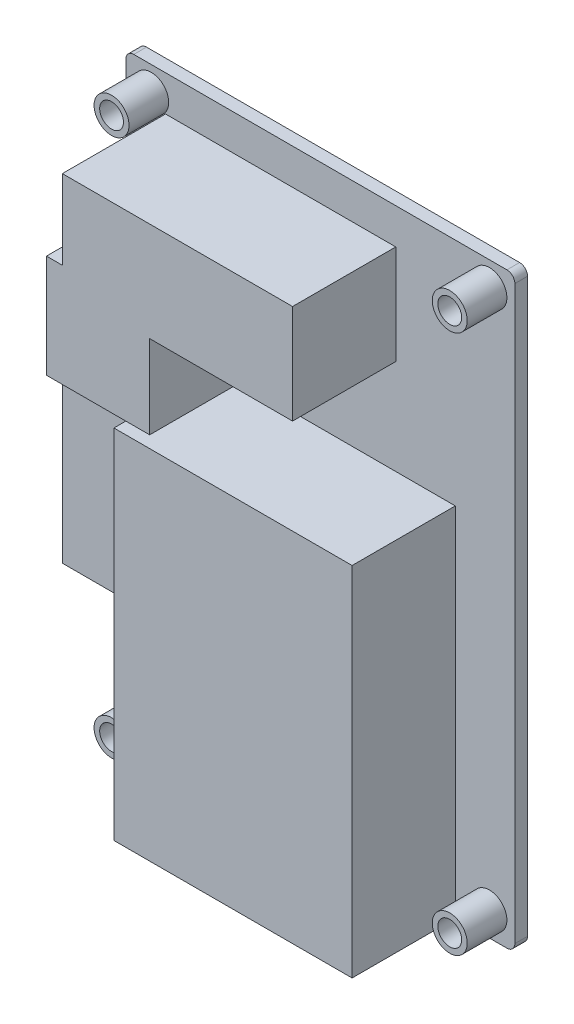
ISO-10303-21;
HEADER;
FILE_DESCRIPTION(('STEP AP214'),'2;1');
FILE_NAME('part.step','',(''),(''),'','','');
FILE_SCHEMA(('AUTOMOTIVE_DESIGN { 1 0 10303 214 1 1 1 1 }'));
ENDSEC;
DATA;
#1=APPLICATION_CONTEXT('core data for automotive mechanical design processes');
#2=APPLICATION_PROTOCOL_DEFINITION('international standard','automotive_design',2000,#1);
#3=PRODUCT_CONTEXT('',#1,'mechanical');
#4=PRODUCT('Part','Part','',(#3));
#5=PRODUCT_RELATED_PRODUCT_CATEGORY('part','',(#4));
#6=PRODUCT_DEFINITION_FORMATION('','',#4);
#7=PRODUCT_DEFINITION_CONTEXT('part definition',#1,'design');
#8=PRODUCT_DEFINITION('design','',#6,#7);
#9=PRODUCT_DEFINITION_SHAPE('','',#8);
#10=(LENGTH_UNIT() NAMED_UNIT(*) SI_UNIT(.MILLI.,.METRE.));
#11=(NAMED_UNIT(*) PLANE_ANGLE_UNIT() SI_UNIT($,.RADIAN.));
#12=(NAMED_UNIT(*) SI_UNIT($,.STERADIAN.) SOLID_ANGLE_UNIT());
#13=UNCERTAINTY_MEASURE_WITH_UNIT(LENGTH_MEASURE(1.E-05),#10,'distance_accuracy_value','');
#14=(GEOMETRIC_REPRESENTATION_CONTEXT(3) GLOBAL_UNCERTAINTY_ASSIGNED_CONTEXT((#13)) GLOBAL_UNIT_ASSIGNED_CONTEXT((#10,
#11,#12)) REPRESENTATION_CONTEXT('',''));
#15=CARTESIAN_POINT('',(0.,0.,0.));
#16=DIRECTION('',(0.,0.,1.));
#17=DIRECTION('',(1.,0.,0.));
#18=AXIS2_PLACEMENT_3D('',#15,#16,#17);
#19=CARTESIAN_POINT('',(-21.5,9.49999999999999,14.6));
#20=DIRECTION('',(1.,0.,0.));
#21=DIRECTION('',(0.,0.,-1.));
#22=AXIS2_PLACEMENT_3D('',#19,#20,#21);
#23=PLANE('',#22);
#24=DIRECTION('',(0.,0.,-1.));
#25=VECTOR('',#24,1.);
#26=CARTESIAN_POINT('',(-21.5,9.99999999999999,4.6));
#27=LINE('',#26,#25);
#28=CARTESIAN_POINT('',(-21.5,9.99999999999999,4.6));
#29=VERTEX_POINT('',#28);
#30=CARTESIAN_POINT('',(-21.5,9.99999999999999,1.6));
#31=VERTEX_POINT('',#30);
#32=EDGE_CURVE('E262',#29,#31,#27,.T.);
#33=ORIENTED_EDGE('',*,*,#32,.F.);
#34=DIRECTION('',(0.,1.,0.));
#35=VECTOR('',#34,1.);
#36=CARTESIAN_POINT('',(-21.5,0.,4.6));
#37=LINE('',#36,#35);
#38=CARTESIAN_POINT('',(-21.5,9.49999999999999,4.6));
#39=VERTEX_POINT('',#38);
#40=EDGE_CURVE('E247',#39,#29,#37,.T.);
#41=ORIENTED_EDGE('',*,*,#40,.F.);
#42=DIRECTION('',(0.,0.,-1.));
#43=VECTOR('',#42,1.);
#44=CARTESIAN_POINT('',(-21.5,9.49999999999999,14.6));
#45=LINE('',#44,#43);
#46=CARTESIAN_POINT('',(-21.5,9.49999999999999,14.6));
#47=VERTEX_POINT('',#46);
#48=EDGE_CURVE('E337',#47,#39,#45,.T.);
#49=ORIENTED_EDGE('',*,*,#48,.F.);
#50=DIRECTION('',(0.,-1.,0.));
#51=VECTOR('',#50,1.);
#52=CARTESIAN_POINT('',(-21.5,9.49999999999999,14.6));
#53=LINE('',#52,#51);
#54=CARTESIAN_POINT('',(-21.5,22.5,14.6));
#55=VERTEX_POINT('',#54);
#56=EDGE_CURVE('E309',#55,#47,#53,.T.);
#57=ORIENTED_EDGE('',*,*,#56,.F.);
#58=DIRECTION('',(0.,0.,-1.));
#59=VECTOR('',#58,1.);
#60=CARTESIAN_POINT('',(-21.5,22.5,14.6));
#61=LINE('',#60,#59);
#62=CARTESIAN_POINT('',(-21.5,22.5,1.6));
#63=VERTEX_POINT('',#62);
#64=EDGE_CURVE('E340',#55,#63,#61,.T.);
#65=ORIENTED_EDGE('',*,*,#64,.T.);
#66=DIRECTION('',(0.,-1.,0.));
#67=VECTOR('',#66,1.);
#68=CARTESIAN_POINT('',(-21.5,9.49999999999999,1.6));
#69=LINE('',#68,#67);
#70=EDGE_CURVE('E331',#63,#31,#69,.T.);
#71=ORIENTED_EDGE('',*,*,#70,.T.);
#72=EDGE_LOOP('',(#33,#41,#49,#57,#65,#71));
#73=FACE_BOUND('',#72,.T.);
#74=ADVANCED_FACE('F42',(#73),#23,.F.);
#75=CARTESIAN_POINT('',(-8.50000000000001,9.49999999999999,14.6));
#76=DIRECTION('',(0.,1.,0.));
#77=DIRECTION('',(-1.,0.,0.));
#78=AXIS2_PLACEMENT_3D('',#75,#76,#77);
#79=PLANE('',#78);
#80=DIRECTION('',(0.,0.,-1.));
#81=VECTOR('',#80,1.);
#82=CARTESIAN_POINT('',(-18.5,9.49999999999999,4.6));
#83=LINE('',#82,#81);
#84=CARTESIAN_POINT('',(-18.5,9.49999999999999,4.6));
#85=VERTEX_POINT('',#84);
#86=CARTESIAN_POINT('',(-18.5,9.49999999999999,1.6));
#87=VERTEX_POINT('',#86);
#88=EDGE_CURVE('E57',#85,#87,#83,.T.);
#89=ORIENTED_EDGE('',*,*,#88,.T.);
#90=DIRECTION('',(1.,0.,0.));
#91=VECTOR('',#90,1.);
#92=CARTESIAN_POINT('',(-8.50000000000001,9.49999999999999,1.6));
#93=LINE('',#92,#91);
#94=CARTESIAN_POINT('',(-8.50000000000001,9.49999999999999,1.6));
#95=VERTEX_POINT('',#94);
#96=EDGE_CURVE('E299',#87,#95,#93,.T.);
#97=ORIENTED_EDGE('',*,*,#96,.T.);
#98=DIRECTION('',(0.,0.,-1.));
#99=VECTOR('',#98,1.);
#100=CARTESIAN_POINT('',(-8.50000000000001,9.49999999999999,14.6));
#101=LINE('',#100,#99);
#102=CARTESIAN_POINT('',(-8.50000000000001,9.49999999999999,14.6));
#103=VERTEX_POINT('',#102);
#104=EDGE_CURVE('E313',#103,#95,#101,.T.);
#105=ORIENTED_EDGE('',*,*,#104,.F.);
#106=DIRECTION('',(1.,0.,0.));
#107=VECTOR('',#106,1.);
#108=CARTESIAN_POINT('',(-8.50000000000001,9.49999999999999,14.6));
#109=LINE('',#108,#107);
#110=EDGE_CURVE('E311',#47,#103,#109,.T.);
#111=ORIENTED_EDGE('',*,*,#110,.F.);
#112=ORIENTED_EDGE('',*,*,#48,.T.);
#113=DIRECTION('',(-1.,0.,0.));
#114=VECTOR('',#113,1.);
#115=CARTESIAN_POINT('',(0.,9.5,4.6));
#116=LINE('',#115,#114);
#117=EDGE_CURVE('E243',#85,#39,#116,.T.);
#118=ORIENTED_EDGE('',*,*,#117,.F.);
#119=EDGE_LOOP('',(#89,#97,#105,#111,#112,#118));
#120=FACE_BOUND('',#119,.T.);
#121=ADVANCED_FACE('F468',(#120),#79,.F.);
#122=CARTESIAN_POINT('',(-23.5,-36.,1.6));
#123=DIRECTION('',(0.,0.,-1.));
#124=DIRECTION('',(-1.,0.,0.));
#125=AXIS2_PLACEMENT_3D('',#122,#123,#124);
#126=PLANE('',#125);
#127=DIRECTION('',(0.,1.,0.));
#128=VECTOR('',#127,1.);
#129=CARTESIAN_POINT('',(-18.5,0.,1.6));
#130=LINE('',#129,#128);
#131=CARTESIAN_POINT('',(-18.5,-20.,1.6));
#132=VERTEX_POINT('',#131);
#133=EDGE_CURVE('E256',#132,#87,#130,.T.);
#134=ORIENTED_EDGE('',*,*,#133,.F.);
#135=DIRECTION('',(-1.,0.,0.));
#136=VECTOR('',#135,1.);
#137=CARTESIAN_POINT('',(0.,-20.,1.6));
#138=LINE('',#137,#136);
#139=CARTESIAN_POINT('',(-24.5,-20.,1.6));
#140=VERTEX_POINT('',#139);
#141=EDGE_CURVE('E253',#132,#140,#138,.T.);
#142=ORIENTED_EDGE('',*,*,#141,.T.);
#143=DIRECTION('',(0.,-1.,0.));
#144=VECTOR('',#143,1.);
#145=CARTESIAN_POINT('',(-24.5,-36.,1.6));
#146=LINE('',#145,#144);
#147=CARTESIAN_POINT('',(-24.5,-36.,1.6));
#148=VERTEX_POINT('',#147);
#149=EDGE_CURVE('E412',#140,#148,#146,.T.);
#150=ORIENTED_EDGE('',*,*,#149,.T.);
#151=CARTESIAN_POINT('',(-23.5,-36.,1.6));
#152=DIRECTION('',(0.,0.,1.));
#153=DIRECTION('',(-1.,0.,0.));
#154=AXIS2_PLACEMENT_3D('',#151,#152,#153);
#155=CIRCLE('',#154,1.);
#156=CARTESIAN_POINT('',(-23.5,-37.,1.6));
#157=VERTEX_POINT('',#156);
#158=EDGE_CURVE('E395',#148,#157,#155,.T.);
#159=ORIENTED_EDGE('',*,*,#158,.T.);
#160=DIRECTION('',(1.,0.,0.));
#161=VECTOR('',#160,1.);
#162=CARTESIAN_POINT('',(-23.5,-37.,1.6));
#163=LINE('',#162,#161);
#164=CARTESIAN_POINT('',(-13.,-37.,1.6));
#165=VERTEX_POINT('',#164);
#166=EDGE_CURVE('E400',#157,#165,#163,.T.);
#167=ORIENTED_EDGE('',*,*,#166,.T.);
#168=DIRECTION('',(0.,-1.,0.));
#169=VECTOR('',#168,1.);
#170=CARTESIAN_POINT('',(-13.,7.99999999999999,1.6));
#171=LINE('',#170,#169);
#172=CARTESIAN_POINT('',(-13.,7.99999999999999,1.6));
#173=VERTEX_POINT('',#172);
#174=EDGE_CURVE('E65',#173,#165,#171,.T.);
#175=ORIENTED_EDGE('',*,*,#174,.F.);
#176=DIRECTION('',(-1.,0.,0.));
#177=VECTOR('',#176,1.);
#178=CARTESIAN_POINT('',(-13.,7.99999999999999,1.6));
#179=LINE('',#178,#177);
#180=CARTESIAN_POINT('',(17.,7.99999999999999,1.6));
#181=VERTEX_POINT('',#180);
#182=EDGE_CURVE('E280',#181,#173,#179,.T.);
#183=ORIENTED_EDGE('',*,*,#182,.F.);
#184=DIRECTION('',(0.,1.,0.));
#185=VECTOR('',#184,1.);
#186=CARTESIAN_POINT('',(17.,7.99999999999999,1.6));
#187=LINE('',#186,#185);
#188=CARTESIAN_POINT('',(17.,-37.,1.6));
#189=VERTEX_POINT('',#188);
#190=EDGE_CURVE('E282',#189,#181,#187,.T.);
#191=ORIENTED_EDGE('',*,*,#190,.F.);
#192=CARTESIAN_POINT('',(23.5,-37.,1.6));
#193=VERTEX_POINT('',#192);
#194=EDGE_CURVE('E398',#189,#193,#163,.T.);
#195=ORIENTED_EDGE('',*,*,#194,.T.);
#196=CARTESIAN_POINT('',(23.5,-36.,1.6));
#197=DIRECTION('',(0.,0.,1.));
#198=DIRECTION('',(1.,0.,0.));
#199=AXIS2_PLACEMENT_3D('',#196,#197,#198);
#200=CIRCLE('',#199,1.);
#201=CARTESIAN_POINT('',(24.5,-36.,1.6));
#202=VERTEX_POINT('',#201);
#203=EDGE_CURVE('E402',#193,#202,#200,.T.);
#204=ORIENTED_EDGE('',*,*,#203,.T.);
#205=DIRECTION('',(0.,1.,0.));
#206=VECTOR('',#205,1.);
#207=CARTESIAN_POINT('',(24.5,-36.,1.6));
#208=LINE('',#207,#206);
#209=CARTESIAN_POINT('',(24.5,36.,1.6));
#210=VERTEX_POINT('',#209);
#211=EDGE_CURVE('E404',#202,#210,#208,.T.);
#212=ORIENTED_EDGE('',*,*,#211,.T.);
#213=CARTESIAN_POINT('',(23.5,36.,1.6));
#214=DIRECTION('',(0.,0.,1.));
#215=DIRECTION('',(-1.,0.,0.));
#216=AXIS2_PLACEMENT_3D('',#213,#214,#215);
#217=CIRCLE('',#216,1.);
#218=CARTESIAN_POINT('',(23.5,37.,1.6));
#219=VERTEX_POINT('',#218);
#220=EDGE_CURVE('E406',#210,#219,#217,.T.);
#221=ORIENTED_EDGE('',*,*,#220,.T.);
#222=DIRECTION('',(-1.,0.,0.));
#223=VECTOR('',#222,1.);
#224=CARTESIAN_POINT('',(-23.5,37.,1.6));
#225=LINE('',#224,#223);
#226=CARTESIAN_POINT('',(-23.5,37.,1.6));
#227=VERTEX_POINT('',#226);
#228=EDGE_CURVE('E408',#219,#227,#225,.T.);
#229=ORIENTED_EDGE('',*,*,#228,.T.);
#230=CARTESIAN_POINT('',(-23.5,36.,1.6));
#231=DIRECTION('',(0.,0.,1.));
#232=DIRECTION('',(-1.,0.,0.));
#233=AXIS2_PLACEMENT_3D('',#230,#231,#232);
#234=CIRCLE('',#233,1.);
#235=CARTESIAN_POINT('',(-24.5,36.,1.6));
#236=VERTEX_POINT('',#235);
#237=EDGE_CURVE('E410',#227,#236,#234,.T.);
#238=ORIENTED_EDGE('',*,*,#237,.T.);
#239=CARTESIAN_POINT('',(-24.5,9.99999999999999,1.6));
#240=VERTEX_POINT('',#239);
#241=EDGE_CURVE('E413',#236,#240,#146,.T.);
#242=ORIENTED_EDGE('',*,*,#241,.T.);
#243=DIRECTION('',(-1.,0.,0.));
#244=VECTOR('',#243,1.);
#245=CARTESIAN_POINT('',(0.,9.99999999999999,1.6));
#246=LINE('',#245,#244);
#247=EDGE_CURVE('E237',#31,#240,#246,.T.);
#248=ORIENTED_EDGE('',*,*,#247,.F.);
#249=ORIENTED_EDGE('',*,*,#70,.F.);
#250=DIRECTION('',(-1.,0.,0.));
#251=VECTOR('',#250,1.);
#252=CARTESIAN_POINT('',(-21.5,22.5,1.6));
#253=LINE('',#252,#251);
#254=CARTESIAN_POINT('',(-19.5,22.5,1.6));
#255=VERTEX_POINT('',#254);
#256=EDGE_CURVE('E328',#255,#63,#253,.T.);
#257=ORIENTED_EDGE('',*,*,#256,.F.);
#258=DIRECTION('',(0.,-1.,0.));
#259=VECTOR('',#258,1.);
#260=CARTESIAN_POINT('',(-19.5,22.5,1.6));
#261=LINE('',#260,#259);
#262=CARTESIAN_POINT('',(-19.5,32.5,1.6));
#263=VERTEX_POINT('',#262);
#264=EDGE_CURVE('E325',#263,#255,#261,.T.);
#265=ORIENTED_EDGE('',*,*,#264,.F.);
#266=DIRECTION('',(-1.,0.,0.));
#267=VECTOR('',#266,1.);
#268=CARTESIAN_POINT('',(-19.5,32.5,1.6));
#269=LINE('',#268,#267);
#270=CARTESIAN_POINT('',(9.49999999999999,32.5,1.6));
#271=VERTEX_POINT('',#270);
#272=EDGE_CURVE('E322',#271,#263,#269,.T.);
#273=ORIENTED_EDGE('',*,*,#272,.F.);
#274=DIRECTION('',(0.,1.,0.));
#275=VECTOR('',#274,1.);
#276=CARTESIAN_POINT('',(9.49999999999999,32.5,1.6));
#277=LINE('',#276,#275);
#278=CARTESIAN_POINT('',(9.49999999999999,20.,1.6));
#279=VERTEX_POINT('',#278);
#280=EDGE_CURVE('E319',#279,#271,#277,.T.);
#281=ORIENTED_EDGE('',*,*,#280,.F.);
#282=DIRECTION('',(1.,0.,0.));
#283=VECTOR('',#282,1.);
#284=CARTESIAN_POINT('',(9.49999999999999,20.,1.6));
#285=LINE('',#284,#283);
#286=CARTESIAN_POINT('',(-8.50000000000001,20.,1.6));
#287=VERTEX_POINT('',#286);
#288=EDGE_CURVE('E316',#287,#279,#285,.T.);
#289=ORIENTED_EDGE('',*,*,#288,.F.);
#290=DIRECTION('',(0.,1.,0.));
#291=VECTOR('',#290,1.);
#292=CARTESIAN_POINT('',(-8.50000000000001,20.,1.6));
#293=LINE('',#292,#291);
#294=EDGE_CURVE('E287',#95,#287,#293,.T.);
#295=ORIENTED_EDGE('',*,*,#294,.F.);
#296=ORIENTED_EDGE('',*,*,#96,.F.);
#297=EDGE_LOOP('',(#134,#142,#150,#159,#167,#175,#183,#191,#195,#204,#212,#221,#229,#238,#242,
#248,#249,#257,#265,#273,#281,#289,#295,#296));
#298=FACE_BOUND('',#297,.T.);
#299=CARTESIAN_POINT('',(-21.3,-33.95,1.6));
#300=DIRECTION('',(0.,0.,-1.));
#301=DIRECTION('',(-1.,0.,0.));
#302=AXIS2_PLACEMENT_3D('',#299,#300,#301);
#303=CIRCLE('',#302,2.2);
#304=CARTESIAN_POINT('',(-23.5,-33.95,1.6));
#305=VERTEX_POINT('',#304);
#306=EDGE_CURVE('E50',#305,#305,#303,.F.);
#307=ORIENTED_EDGE('',*,*,#306,.F.);
#308=EDGE_LOOP('',(#307));
#309=FACE_BOUND('',#308,.T.);
#310=CARTESIAN_POINT('',(-21.3,33.95,1.6));
#311=DIRECTION('',(0.,0.,-1.));
#312=DIRECTION('',(-1.,0.,0.));
#313=AXIS2_PLACEMENT_3D('',#310,#311,#312);
#314=CIRCLE('',#313,2.2);
#315=CARTESIAN_POINT('',(-23.5,33.95,1.6));
#316=VERTEX_POINT('',#315);
#317=EDGE_CURVE('E455',#316,#316,#314,.F.);
#318=ORIENTED_EDGE('',*,*,#317,.F.);
#319=EDGE_LOOP('',(#318));
#320=FACE_BOUND('',#319,.T.);
#321=CARTESIAN_POINT('',(21.3,-33.95,1.6));
#322=DIRECTION('',(0.,0.,-1.));
#323=DIRECTION('',(-1.,0.,0.));
#324=AXIS2_PLACEMENT_3D('',#321,#322,#323);
#325=CIRCLE('',#324,2.2);
#326=CARTESIAN_POINT('',(19.1,-33.95,1.6));
#327=VERTEX_POINT('',#326);
#328=EDGE_CURVE('E458',#327,#327,#325,.F.);
#329=ORIENTED_EDGE('',*,*,#328,.F.);
#330=EDGE_LOOP('',(#329));
#331=FACE_BOUND('',#330,.T.);
#332=CARTESIAN_POINT('',(21.3,33.95,1.6));
#333=DIRECTION('',(0.,0.,-1.));
#334=DIRECTION('',(-1.,0.,0.));
#335=AXIS2_PLACEMENT_3D('',#332,#333,#334);
#336=CIRCLE('',#335,2.2);
#337=CARTESIAN_POINT('',(19.1,33.95,1.6));
#338=VERTEX_POINT('',#337);
#339=EDGE_CURVE('E11',#338,#338,#336,.F.);
#340=ORIENTED_EDGE('',*,*,#339,.F.);
#341=EDGE_LOOP('',(#340));
#342=FACE_BOUND('',#341,.T.);
#343=ADVANCED_FACE('F465',(#298,#309,#320,#331,#342),#126,.F.);
#344=CARTESIAN_POINT('',(-23.5,-36.,1.6));
#345=DIRECTION('',(0.,0.,-1.));
#346=DIRECTION('',(-1.,0.,0.));
#347=AXIS2_PLACEMENT_3D('',#344,#345,#346);
#348=CYLINDRICAL_SURFACE('',#347,1.);
#349=CARTESIAN_POINT('',(-23.5,-36.,0.));
#350=DIRECTION('',(0.,0.,1.));
#351=DIRECTION('',(-1.,0.,0.));
#352=AXIS2_PLACEMENT_3D('',#349,#350,#351);
#353=CIRCLE('',#352,1.);
#354=CARTESIAN_POINT('',(-24.5,-36.,0.));
#355=VERTEX_POINT('',#354);
#356=CARTESIAN_POINT('',(-23.5,-37.,0.));
#357=VERTEX_POINT('',#356);
#358=EDGE_CURVE('E394',#355,#357,#353,.T.);
#359=ORIENTED_EDGE('',*,*,#358,.T.);
#360=DIRECTION('',(0.,0.,-1.));
#361=VECTOR('',#360,1.);
#362=CARTESIAN_POINT('',(-23.5,-37.,1.6));
#363=LINE('',#362,#361);
#364=EDGE_CURVE('E452',#157,#357,#363,.T.);
#365=ORIENTED_EDGE('',*,*,#364,.F.);
#366=ORIENTED_EDGE('',*,*,#158,.F.);
#367=DIRECTION('',(0.,0.,-1.));
#368=VECTOR('',#367,1.);
#369=CARTESIAN_POINT('',(-24.5,-36.,1.6));
#370=LINE('',#369,#368);
#371=EDGE_CURVE('E416',#148,#355,#370,.T.);
#372=ORIENTED_EDGE('',*,*,#371,.T.);
#373=EDGE_LOOP('',(#359,#365,#366,#372));
#374=FACE_BOUND('',#373,.T.);
#375=ADVANCED_FACE('F44',(#374),#348,.T.);
#376=CARTESIAN_POINT('',(-23.5,-37.,1.6));
#377=DIRECTION('',(0.,1.,0.));
#378=DIRECTION('',(0.,0.,1.));
#379=AXIS2_PLACEMENT_3D('',#376,#377,#378);
#380=PLANE('',#379);
#381=DIRECTION('',(1.,0.,0.));
#382=VECTOR('',#381,1.);
#383=CARTESIAN_POINT('',(-23.5,-37.,0.));
#384=LINE('',#383,#382);
#385=CARTESIAN_POINT('',(23.5,-37.,0.));
#386=VERTEX_POINT('',#385);
#387=EDGE_CURVE('E419',#357,#386,#384,.T.);
#388=ORIENTED_EDGE('',*,*,#387,.T.);
#389=DIRECTION('',(0.,0.,-1.));
#390=VECTOR('',#389,1.);
#391=CARTESIAN_POINT('',(23.5,-37.,1.6));
#392=LINE('',#391,#390);
#393=EDGE_CURVE('E449',#193,#386,#392,.T.);
#394=ORIENTED_EDGE('',*,*,#393,.F.);
#395=ORIENTED_EDGE('',*,*,#194,.F.);
#396=DIRECTION('',(0.,0.,-1.));
#397=VECTOR('',#396,1.);
#398=CARTESIAN_POINT('',(17.,-37.,14.6));
#399=LINE('',#398,#397);
#400=CARTESIAN_POINT('',(17.,-37.,14.6));
#401=VERTEX_POINT('',#400);
#402=EDGE_CURVE('E270',#401,#189,#399,.T.);
#403=ORIENTED_EDGE('',*,*,#402,.F.);
#404=DIRECTION('',(1.,0.,0.));
#405=VECTOR('',#404,1.);
#406=CARTESIAN_POINT('',(-13.,-37.,14.6));
#407=LINE('',#406,#405);
#408=CARTESIAN_POINT('',(-13.,-37.,14.6));
#409=VERTEX_POINT('',#408);
#410=EDGE_CURVE('E291',#409,#401,#407,.T.);
#411=ORIENTED_EDGE('',*,*,#410,.F.);
#412=DIRECTION('',(0.,0.,-1.));
#413=VECTOR('',#412,1.);
#414=CARTESIAN_POINT('',(-13.,-37.,14.6));
#415=LINE('',#414,#413);
#416=EDGE_CURVE('E267',#409,#165,#415,.T.);
#417=ORIENTED_EDGE('',*,*,#416,.T.);
#418=ORIENTED_EDGE('',*,*,#166,.F.);
#419=ORIENTED_EDGE('',*,*,#364,.T.);
#420=EDGE_LOOP('',(#388,#394,#395,#403,#411,#417,#418,#419));
#421=FACE_BOUND('',#420,.T.);
#422=ADVANCED_FACE('F560',(#421),#380,.F.);
#423=CARTESIAN_POINT('',(23.5,-36.,1.6));
#424=DIRECTION('',(0.,0.,-1.));
#425=DIRECTION('',(-1.,0.,0.));
#426=AXIS2_PLACEMENT_3D('',#423,#424,#425);
#427=CYLINDRICAL_SURFACE('',#426,1.);
#428=CARTESIAN_POINT('',(23.5,-36.,0.));
#429=DIRECTION('',(0.,0.,1.));
#430=DIRECTION('',(1.,0.,0.));
#431=AXIS2_PLACEMENT_3D('',#428,#429,#430);
#432=CIRCLE('',#431,1.);
#433=CARTESIAN_POINT('',(24.5,-36.,0.));
#434=VERTEX_POINT('',#433);
#435=EDGE_CURVE('E421',#386,#434,#432,.T.);
#436=ORIENTED_EDGE('',*,*,#435,.T.);
#437=DIRECTION('',(0.,0.,-1.));
#438=VECTOR('',#437,1.);
#439=CARTESIAN_POINT('',(24.5,-36.,1.6));
#440=LINE('',#439,#438);
#441=EDGE_CURVE('E446',#202,#434,#440,.T.);
#442=ORIENTED_EDGE('',*,*,#441,.F.);
#443=ORIENTED_EDGE('',*,*,#203,.F.);
#444=ORIENTED_EDGE('',*,*,#393,.T.);
#445=EDGE_LOOP('',(#436,#442,#443,#444));
#446=FACE_BOUND('',#445,.T.);
#447=ADVANCED_FACE('F581',(#446),#427,.T.);
#448=CARTESIAN_POINT('',(24.5,-36.,1.6));
#449=DIRECTION('',(-1.,0.,0.));
#450=DIRECTION('',(0.,0.,1.));
#451=AXIS2_PLACEMENT_3D('',#448,#449,#450);
#452=PLANE('',#451);
#453=DIRECTION('',(0.,1.,0.));
#454=VECTOR('',#453,1.);
#455=CARTESIAN_POINT('',(24.5,-36.,0.));
#456=LINE('',#455,#454);
#457=CARTESIAN_POINT('',(24.5,36.,0.));
#458=VERTEX_POINT('',#457);
#459=EDGE_CURVE('E423',#434,#458,#456,.T.);
#460=ORIENTED_EDGE('',*,*,#459,.T.);
#461=DIRECTION('',(0.,0.,-1.));
#462=VECTOR('',#461,1.);
#463=CARTESIAN_POINT('',(24.5,36.,1.6));
#464=LINE('',#463,#462);
#465=EDGE_CURVE('E443',#210,#458,#464,.T.);
#466=ORIENTED_EDGE('',*,*,#465,.F.);
#467=ORIENTED_EDGE('',*,*,#211,.F.);
#468=ORIENTED_EDGE('',*,*,#441,.T.);
#469=EDGE_LOOP('',(#460,#466,#467,#468));
#470=FACE_BOUND('',#469,.T.);
#471=ADVANCED_FACE('F585',(#470),#452,.F.);
#472=CARTESIAN_POINT('',(23.5,36.,1.6));
#473=DIRECTION('',(0.,0.,-1.));
#474=DIRECTION('',(-1.,0.,0.));
#475=AXIS2_PLACEMENT_3D('',#472,#473,#474);
#476=CYLINDRICAL_SURFACE('',#475,1.);
#477=CARTESIAN_POINT('',(23.5,36.,0.));
#478=DIRECTION('',(0.,0.,1.));
#479=DIRECTION('',(-1.,0.,0.));
#480=AXIS2_PLACEMENT_3D('',#477,#478,#479);
#481=CIRCLE('',#480,1.);
#482=CARTESIAN_POINT('',(23.5,37.,0.));
#483=VERTEX_POINT('',#482);
#484=EDGE_CURVE('E425',#458,#483,#481,.T.);
#485=ORIENTED_EDGE('',*,*,#484,.T.);
#486=DIRECTION('',(0.,0.,-1.));
#487=VECTOR('',#486,1.);
#488=CARTESIAN_POINT('',(23.5,37.,1.6));
#489=LINE('',#488,#487);
#490=EDGE_CURVE('E440',#219,#483,#489,.T.);
#491=ORIENTED_EDGE('',*,*,#490,.F.);
#492=ORIENTED_EDGE('',*,*,#220,.F.);
#493=ORIENTED_EDGE('',*,*,#465,.T.);
#494=EDGE_LOOP('',(#485,#491,#492,#493));
#495=FACE_BOUND('',#494,.T.);
#496=ADVANCED_FACE('F590',(#495),#476,.T.);
#497=CARTESIAN_POINT('',(-23.5,37.,1.6));
#498=DIRECTION('',(0.,-1.,0.));
#499=DIRECTION('',(0.,0.,-1.));
#500=AXIS2_PLACEMENT_3D('',#497,#498,#499);
#501=PLANE('',#500);
#502=DIRECTION('',(-1.,0.,0.));
#503=VECTOR('',#502,1.);
#504=CARTESIAN_POINT('',(-23.5,37.,0.));
#505=LINE('',#504,#503);
#506=CARTESIAN_POINT('',(-23.5,37.,0.));
#507=VERTEX_POINT('',#506);
#508=EDGE_CURVE('E427',#483,#507,#505,.T.);
#509=ORIENTED_EDGE('',*,*,#508,.T.);
#510=DIRECTION('',(0.,0.,-1.));
#511=VECTOR('',#510,1.);
#512=CARTESIAN_POINT('',(-23.5,37.,1.6));
#513=LINE('',#512,#511);
#514=EDGE_CURVE('E437',#227,#507,#513,.T.);
#515=ORIENTED_EDGE('',*,*,#514,.F.);
#516=ORIENTED_EDGE('',*,*,#228,.F.);
#517=ORIENTED_EDGE('',*,*,#490,.T.);
#518=EDGE_LOOP('',(#509,#515,#516,#517));
#519=FACE_BOUND('',#518,.T.);
#520=ADVANCED_FACE('F594',(#519),#501,.F.);
#521=CARTESIAN_POINT('',(-23.5,36.,1.6));
#522=DIRECTION('',(0.,0.,-1.));
#523=DIRECTION('',(-1.,0.,0.));
#524=AXIS2_PLACEMENT_3D('',#521,#522,#523);
#525=CYLINDRICAL_SURFACE('',#524,1.);
#526=CARTESIAN_POINT('',(-23.5,36.,0.));
#527=DIRECTION('',(0.,0.,1.));
#528=DIRECTION('',(-1.,0.,0.));
#529=AXIS2_PLACEMENT_3D('',#526,#527,#528);
#530=CIRCLE('',#529,1.);
#531=CARTESIAN_POINT('',(-24.5,36.,0.));
#532=VERTEX_POINT('',#531);
#533=EDGE_CURVE('E429',#507,#532,#530,.T.);
#534=ORIENTED_EDGE('',*,*,#533,.T.);
#535=DIRECTION('',(0.,0.,-1.));
#536=VECTOR('',#535,1.);
#537=CARTESIAN_POINT('',(-24.5,36.,1.6));
#538=LINE('',#537,#536);
#539=EDGE_CURVE('E434',#236,#532,#538,.T.);
#540=ORIENTED_EDGE('',*,*,#539,.F.);
#541=ORIENTED_EDGE('',*,*,#237,.F.);
#542=ORIENTED_EDGE('',*,*,#514,.T.);
#543=EDGE_LOOP('',(#534,#540,#541,#542));
#544=FACE_BOUND('',#543,.T.);
#545=ADVANCED_FACE('F598',(#544),#525,.T.);
#546=CARTESIAN_POINT('',(-24.5,-36.,1.6));
#547=DIRECTION('',(1.,0.,0.));
#548=DIRECTION('',(0.,0.,-1.));
#549=AXIS2_PLACEMENT_3D('',#546,#547,#548);
#550=PLANE('',#549);
#551=DIRECTION('',(0.,-1.,0.));
#552=VECTOR('',#551,1.);
#553=CARTESIAN_POINT('',(-24.5,-36.,0.));
#554=LINE('',#553,#552);
#555=EDGE_CURVE('E399',#532,#355,#554,.T.);
#556=ORIENTED_EDGE('',*,*,#555,.T.);
#557=ORIENTED_EDGE('',*,*,#371,.F.);
#558=ORIENTED_EDGE('',*,*,#149,.F.);
#559=DIRECTION('',(0.,-1.,0.));
#560=VECTOR('',#559,1.);
#561=CARTESIAN_POINT('',(-24.5,-36.,1.6));
#562=LINE('',#561,#560);
#563=EDGE_CURVE('E227',#240,#140,#562,.T.);
#564=ORIENTED_EDGE('',*,*,#563,.F.);
#565=ORIENTED_EDGE('',*,*,#241,.F.);
#566=ORIENTED_EDGE('',*,*,#539,.T.);
#567=EDGE_LOOP('',(#556,#557,#558,#564,#565,#566));
#568=FACE_BOUND('',#567,.T.);
#569=ADVANCED_FACE('F549',(#568),#550,.F.);
#570=CARTESIAN_POINT('',(-23.5,-36.,0.));
#571=DIRECTION('',(0.,0.,-1.));
#572=DIRECTION('',(-1.,0.,0.));
#573=AXIS2_PLACEMENT_3D('',#570,#571,#572);
#574=PLANE('',#573);
#575=CARTESIAN_POINT('',(21.3,-33.95,0.));
#576=DIRECTION('',(0.,0.,1.));
#577=DIRECTION('',(1.,0.,0.));
#578=AXIS2_PLACEMENT_3D('',#575,#576,#577);
#579=CIRCLE('',#578,1.5);
#580=CARTESIAN_POINT('',(22.8,-33.95,0.));
#581=VERTEX_POINT('',#580);
#582=EDGE_CURVE('E382',#581,#581,#579,.T.);
#583=ORIENTED_EDGE('',*,*,#582,.T.);
#584=EDGE_LOOP('',(#583));
#585=FACE_BOUND('',#584,.T.);
#586=CARTESIAN_POINT('',(-21.3,-33.95,0.));
#587=DIRECTION('',(0.,0.,1.));
#588=DIRECTION('',(1.,0.,0.));
#589=AXIS2_PLACEMENT_3D('',#586,#587,#588);
#590=CIRCLE('',#589,1.5);
#591=CARTESIAN_POINT('',(-19.8,-33.95,0.));
#592=VERTEX_POINT('',#591);
#593=EDGE_CURVE('E387',#592,#592,#590,.T.);
#594=ORIENTED_EDGE('',*,*,#593,.T.);
#595=EDGE_LOOP('',(#594));
#596=FACE_BOUND('',#595,.T.);
#597=CARTESIAN_POINT('',(-21.3,33.95,0.));
#598=DIRECTION('',(0.,0.,1.));
#599=DIRECTION('',(1.,0.,0.));
#600=AXIS2_PLACEMENT_3D('',#597,#598,#599);
#601=CIRCLE('',#600,1.5);
#602=CARTESIAN_POINT('',(-19.8,33.95,0.));
#603=VERTEX_POINT('',#602);
#604=EDGE_CURVE('E383',#603,#603,#601,.T.);
#605=ORIENTED_EDGE('',*,*,#604,.T.);
#606=EDGE_LOOP('',(#605));
#607=FACE_BOUND('',#606,.T.);
#608=CARTESIAN_POINT('',(21.3,33.95,0.));
#609=DIRECTION('',(0.,0.,1.));
#610=DIRECTION('',(1.,0.,0.));
#611=AXIS2_PLACEMENT_3D('',#608,#609,#610);
#612=CIRCLE('',#611,1.5);
#613=CARTESIAN_POINT('',(22.8,33.95,0.));
#614=VERTEX_POINT('',#613);
#615=EDGE_CURVE('E386',#614,#614,#612,.T.);
#616=ORIENTED_EDGE('',*,*,#615,.T.);
#617=EDGE_LOOP('',(#616));
#618=FACE_BOUND('',#617,.T.);
#619=ORIENTED_EDGE('',*,*,#358,.F.);
#620=ORIENTED_EDGE('',*,*,#555,.F.);
#621=ORIENTED_EDGE('',*,*,#533,.F.);
#622=ORIENTED_EDGE('',*,*,#508,.F.);
#623=ORIENTED_EDGE('',*,*,#484,.F.);
#624=ORIENTED_EDGE('',*,*,#459,.F.);
#625=ORIENTED_EDGE('',*,*,#435,.F.);
#626=ORIENTED_EDGE('',*,*,#387,.F.);
#627=EDGE_LOOP('',(#619,#620,#621,#622,#623,#624,#625,#626));
#628=FACE_BOUND('',#627,.T.);
#629=ADVANCED_FACE('F600',(#585,#596,#607,#618,#628),#574,.T.);
#630=CARTESIAN_POINT('',(21.3,33.95,0.));
#631=DIRECTION('',(0.,0.,1.));
#632=DIRECTION('',(1.,0.,0.));
#633=AXIS2_PLACEMENT_3D('',#630,#631,#632);
#634=CYLINDRICAL_SURFACE('',#633,1.5);
#635=ORIENTED_EDGE('',*,*,#615,.F.);
#636=EDGE_LOOP('',(#635));
#637=FACE_BOUND('',#636,.T.);
#638=CARTESIAN_POINT('',(21.3,33.95,6.6));
#639=DIRECTION('',(0.,0.,1.));
#640=DIRECTION('',(1.,0.,0.));
#641=AXIS2_PLACEMENT_3D('',#638,#639,#640);
#642=CIRCLE('',#641,1.5);
#643=CARTESIAN_POINT('',(22.8,33.95,6.6));
#644=VERTEX_POINT('',#643);
#645=EDGE_CURVE('E361',#644,#644,#642,.T.);
#646=ORIENTED_EDGE('',*,*,#645,.T.);
#647=EDGE_LOOP('',(#646));
#648=FACE_BOUND('',#647,.T.);
#649=ADVANCED_FACE('F602',(#637,#648),#634,.F.);
#650=CARTESIAN_POINT('',(-21.3,33.95,0.));
#651=DIRECTION('',(0.,0.,1.));
#652=DIRECTION('',(1.,0.,0.));
#653=AXIS2_PLACEMENT_3D('',#650,#651,#652);
#654=CYLINDRICAL_SURFACE('',#653,1.5);
#655=ORIENTED_EDGE('',*,*,#604,.F.);
#656=EDGE_LOOP('',(#655));
#657=FACE_BOUND('',#656,.T.);
#658=CARTESIAN_POINT('',(-21.3,33.95,6.6));
#659=DIRECTION('',(0.,0.,1.));
#660=DIRECTION('',(1.,0.,0.));
#661=AXIS2_PLACEMENT_3D('',#658,#659,#660);
#662=CIRCLE('',#661,1.5);
#663=CARTESIAN_POINT('',(-19.8,33.95,6.6));
#664=VERTEX_POINT('',#663);
#665=EDGE_CURVE('E376',#664,#664,#662,.T.);
#666=ORIENTED_EDGE('',*,*,#665,.T.);
#667=EDGE_LOOP('',(#666));
#668=FACE_BOUND('',#667,.T.);
#669=ADVANCED_FACE('F609',(#657,#668),#654,.F.);
#670=CARTESIAN_POINT('',(-21.3,-33.95,0.));
#671=DIRECTION('',(0.,0.,1.));
#672=DIRECTION('',(1.,0.,0.));
#673=AXIS2_PLACEMENT_3D('',#670,#671,#672);
#674=CYLINDRICAL_SURFACE('',#673,1.5);
#675=ORIENTED_EDGE('',*,*,#593,.F.);
#676=EDGE_LOOP('',(#675));
#677=FACE_BOUND('',#676,.T.);
#678=CARTESIAN_POINT('',(-21.3,-33.95,6.6));
#679=DIRECTION('',(0.,0.,1.));
#680=DIRECTION('',(1.,0.,0.));
#681=AXIS2_PLACEMENT_3D('',#678,#679,#680);
#682=CIRCLE('',#681,1.5);
#683=CARTESIAN_POINT('',(-19.8,-33.95,6.6));
#684=VERTEX_POINT('',#683);
#685=EDGE_CURVE('E367',#684,#684,#682,.T.);
#686=ORIENTED_EDGE('',*,*,#685,.T.);
#687=EDGE_LOOP('',(#686));
#688=FACE_BOUND('',#687,.T.);
#689=ADVANCED_FACE('F824',(#677,#688),#674,.F.);
#690=CARTESIAN_POINT('',(21.3,-33.95,0.));
#691=DIRECTION('',(0.,0.,1.));
#692=DIRECTION('',(1.,0.,0.));
#693=AXIS2_PLACEMENT_3D('',#690,#691,#692);
#694=CYLINDRICAL_SURFACE('',#693,1.5);
#695=ORIENTED_EDGE('',*,*,#582,.F.);
#696=EDGE_LOOP('',(#695));
#697=FACE_BOUND('',#696,.T.);
#698=CARTESIAN_POINT('',(21.3,-33.95,6.6));
#699=DIRECTION('',(0.,0.,1.));
#700=DIRECTION('',(1.,0.,0.));
#701=AXIS2_PLACEMENT_3D('',#698,#699,#700);
#702=CIRCLE('',#701,1.5);
#703=CARTESIAN_POINT('',(22.8,-33.95,6.6));
#704=VERTEX_POINT('',#703);
#705=EDGE_CURVE('E373',#704,#704,#702,.T.);
#706=ORIENTED_EDGE('',*,*,#705,.T.);
#707=EDGE_LOOP('',(#706));
#708=FACE_BOUND('',#707,.T.);
#709=ADVANCED_FACE('F813',(#697,#708),#694,.F.);
#710=CARTESIAN_POINT('',(-21.3,33.95,6.6));
#711=DIRECTION('',(0.,0.,1.));
#712=DIRECTION('',(1.,0.,0.));
#713=AXIS2_PLACEMENT_3D('',#710,#711,#712);
#714=PLANE('',#713);
#715=CARTESIAN_POINT('',(-21.3,33.95,6.6));
#716=DIRECTION('',(0.,0.,1.));
#717=DIRECTION('',(1.,0.,0.));
#718=AXIS2_PLACEMENT_3D('',#715,#716,#717);
#719=CIRCLE('',#718,2.2);
#720=CARTESIAN_POINT('',(-19.1,33.95,6.6));
#721=VERTEX_POINT('',#720);
#722=EDGE_CURVE('E379',#721,#721,#719,.T.);
#723=ORIENTED_EDGE('',*,*,#722,.T.);
#724=EDGE_LOOP('',(#723));
#725=FACE_BOUND('',#724,.T.);
#726=ORIENTED_EDGE('',*,*,#665,.F.);
#727=EDGE_LOOP('',(#726));
#728=FACE_BOUND('',#727,.T.);
#729=ADVANCED_FACE('F802',(#725,#728),#714,.T.);
#730=CARTESIAN_POINT('',(-21.3,33.95,6.6));
#731=DIRECTION('',(0.,0.,-1.));
#732=DIRECTION('',(-1.,0.,0.));
#733=AXIS2_PLACEMENT_3D('',#730,#731,#732);
#734=CYLINDRICAL_SURFACE('',#733,2.2);
#735=ORIENTED_EDGE('',*,*,#722,.F.);
#736=EDGE_LOOP('',(#735));
#737=FACE_BOUND('',#736,.T.);
#738=ORIENTED_EDGE('',*,*,#317,.T.);
#739=EDGE_LOOP('',(#738));
#740=FACE_BOUND('',#739,.T.);
#741=ADVANCED_FACE('F791',(#737,#740),#734,.T.);
#742=CARTESIAN_POINT('',(21.3,-33.95,6.6));
#743=DIRECTION('',(0.,0.,1.));
#744=DIRECTION('',(1.,0.,0.));
#745=AXIS2_PLACEMENT_3D('',#742,#743,#744);
#746=PLANE('',#745);
#747=CARTESIAN_POINT('',(21.3,-33.95,6.6));
#748=DIRECTION('',(0.,0.,1.));
#749=DIRECTION('',(1.,0.,0.));
#750=AXIS2_PLACEMENT_3D('',#747,#748,#749);
#751=CIRCLE('',#750,2.2);
#752=CARTESIAN_POINT('',(23.5,-33.95,6.6));
#753=VERTEX_POINT('',#752);
#754=EDGE_CURVE('E370',#753,#753,#751,.T.);
#755=ORIENTED_EDGE('',*,*,#754,.T.);
#756=EDGE_LOOP('',(#755));
#757=FACE_BOUND('',#756,.T.);
#758=ORIENTED_EDGE('',*,*,#705,.F.);
#759=EDGE_LOOP('',(#758));
#760=FACE_BOUND('',#759,.T.);
#761=ADVANCED_FACE('F780',(#757,#760),#746,.T.);
#762=CARTESIAN_POINT('',(21.3,-33.95,6.6));
#763=DIRECTION('',(0.,0.,-1.));
#764=DIRECTION('',(-1.,0.,0.));
#765=AXIS2_PLACEMENT_3D('',#762,#763,#764);
#766=CYLINDRICAL_SURFACE('',#765,2.2);
#767=ORIENTED_EDGE('',*,*,#754,.F.);
#768=EDGE_LOOP('',(#767));
#769=FACE_BOUND('',#768,.T.);
#770=ORIENTED_EDGE('',*,*,#328,.T.);
#771=EDGE_LOOP('',(#770));
#772=FACE_BOUND('',#771,.T.);
#773=ADVANCED_FACE('F769',(#769,#772),#766,.T.);
#774=CARTESIAN_POINT('',(-21.3,-33.95,6.6));
#775=DIRECTION('',(0.,0.,1.));
#776=DIRECTION('',(1.,0.,0.));
#777=AXIS2_PLACEMENT_3D('',#774,#775,#776);
#778=PLANE('',#777);
#779=CARTESIAN_POINT('',(-21.3,-33.95,6.6));
#780=DIRECTION('',(0.,0.,1.));
#781=DIRECTION('',(1.,0.,0.));
#782=AXIS2_PLACEMENT_3D('',#779,#780,#781);
#783=CIRCLE('',#782,2.2);
#784=CARTESIAN_POINT('',(-19.1,-33.95,6.6));
#785=VERTEX_POINT('',#784);
#786=EDGE_CURVE('E364',#785,#785,#783,.T.);
#787=ORIENTED_EDGE('',*,*,#786,.T.);
#788=EDGE_LOOP('',(#787));
#789=FACE_BOUND('',#788,.T.);
#790=ORIENTED_EDGE('',*,*,#685,.F.);
#791=EDGE_LOOP('',(#790));
#792=FACE_BOUND('',#791,.T.);
#793=ADVANCED_FACE('F758',(#789,#792),#778,.T.);
#794=CARTESIAN_POINT('',(-21.3,-33.95,6.6));
#795=DIRECTION('',(0.,0.,-1.));
#796=DIRECTION('',(-1.,0.,0.));
#797=AXIS2_PLACEMENT_3D('',#794,#795,#796);
#798=CYLINDRICAL_SURFACE('',#797,2.2);
#799=ORIENTED_EDGE('',*,*,#786,.F.);
#800=EDGE_LOOP('',(#799));
#801=FACE_BOUND('',#800,.T.);
#802=ORIENTED_EDGE('',*,*,#306,.T.);
#803=EDGE_LOOP('',(#802));
#804=FACE_BOUND('',#803,.T.);
#805=ADVANCED_FACE('F463',(#801,#804),#798,.T.);
#806=CARTESIAN_POINT('',(21.3,33.95,6.6));
#807=DIRECTION('',(0.,0.,1.));
#808=DIRECTION('',(1.,0.,0.));
#809=AXIS2_PLACEMENT_3D('',#806,#807,#808);
#810=PLANE('',#809);
#811=CARTESIAN_POINT('',(21.3,33.95,6.6));
#812=DIRECTION('',(0.,0.,1.));
#813=DIRECTION('',(1.,0.,0.));
#814=AXIS2_PLACEMENT_3D('',#811,#812,#813);
#815=CIRCLE('',#814,2.2);
#816=CARTESIAN_POINT('',(23.5,33.95,6.6));
#817=VERTEX_POINT('',#816);
#818=EDGE_CURVE('E358',#817,#817,#815,.T.);
#819=ORIENTED_EDGE('',*,*,#818,.T.);
#820=EDGE_LOOP('',(#819));
#821=FACE_BOUND('',#820,.T.);
#822=ORIENTED_EDGE('',*,*,#645,.F.);
#823=EDGE_LOOP('',(#822));
#824=FACE_BOUND('',#823,.T.);
#825=ADVANCED_FACE('F479',(#821,#824),#810,.T.);
#826=CARTESIAN_POINT('',(21.3,33.95,6.6));
#827=DIRECTION('',(0.,0.,-1.));
#828=DIRECTION('',(-1.,0.,0.));
#829=AXIS2_PLACEMENT_3D('',#826,#827,#828);
#830=CYLINDRICAL_SURFACE('',#829,2.2);
#831=ORIENTED_EDGE('',*,*,#818,.F.);
#832=EDGE_LOOP('',(#831));
#833=FACE_BOUND('',#832,.T.);
#834=ORIENTED_EDGE('',*,*,#339,.T.);
#835=EDGE_LOOP('',(#834));
#836=FACE_BOUND('',#835,.T.);
#837=ADVANCED_FACE('F476',(#833,#836),#830,.T.);
#838=CARTESIAN_POINT('',(-8.50000000000001,20.,14.6));
#839=DIRECTION('',(-1.,0.,0.));
#840=DIRECTION('',(0.,-1.,0.));
#841=AXIS2_PLACEMENT_3D('',#838,#839,#840);
#842=PLANE('',#841);
#843=ORIENTED_EDGE('',*,*,#294,.T.);
#844=DIRECTION('',(0.,0.,-1.));
#845=VECTOR('',#844,1.);
#846=CARTESIAN_POINT('',(-8.50000000000001,20.,14.6));
#847=LINE('',#846,#845);
#848=CARTESIAN_POINT('',(-8.50000000000001,20.,14.6));
#849=VERTEX_POINT('',#848);
#850=EDGE_CURVE('E355',#849,#287,#847,.T.);
#851=ORIENTED_EDGE('',*,*,#850,.F.);
#852=DIRECTION('',(0.,1.,0.));
#853=VECTOR('',#852,1.);
#854=CARTESIAN_POINT('',(-8.50000000000001,20.,14.6));
#855=LINE('',#854,#853);
#856=EDGE_CURVE('E295',#103,#849,#855,.T.);
#857=ORIENTED_EDGE('',*,*,#856,.F.);
#858=ORIENTED_EDGE('',*,*,#104,.T.);
#859=EDGE_LOOP('',(#843,#851,#857,#858));
#860=FACE_BOUND('',#859,.T.);
#861=ADVANCED_FACE('F478',(#860),#842,.F.);
#862=CARTESIAN_POINT('',(9.49999999999999,20.,14.6));
#863=DIRECTION('',(0.,1.,0.));
#864=DIRECTION('',(-1.,0.,0.));
#865=AXIS2_PLACEMENT_3D('',#862,#863,#864);
#866=PLANE('',#865);
#867=ORIENTED_EDGE('',*,*,#288,.T.);
#868=DIRECTION('',(0.,0.,-1.));
#869=VECTOR('',#868,1.);
#870=CARTESIAN_POINT('',(9.49999999999999,20.,14.6));
#871=LINE('',#870,#869);
#872=CARTESIAN_POINT('',(9.49999999999999,20.,14.6));
#873=VERTEX_POINT('',#872);
#874=EDGE_CURVE('E352',#873,#279,#871,.T.);
#875=ORIENTED_EDGE('',*,*,#874,.F.);
#876=DIRECTION('',(1.,0.,0.));
#877=VECTOR('',#876,1.);
#878=CARTESIAN_POINT('',(9.49999999999999,20.,14.6));
#879=LINE('',#878,#877);
#880=EDGE_CURVE('E298',#849,#873,#879,.T.);
#881=ORIENTED_EDGE('',*,*,#880,.F.);
#882=ORIENTED_EDGE('',*,*,#850,.T.);
#883=EDGE_LOOP('',(#867,#875,#881,#882));
#884=FACE_BOUND('',#883,.T.);
#885=ADVANCED_FACE('F486',(#884),#866,.F.);
#886=CARTESIAN_POINT('',(9.49999999999999,32.5,14.6));
#887=DIRECTION('',(-1.,0.,0.));
#888=DIRECTION('',(0.,-1.,0.));
#889=AXIS2_PLACEMENT_3D('',#886,#887,#888);
#890=PLANE('',#889);
#891=ORIENTED_EDGE('',*,*,#280,.T.);
#892=DIRECTION('',(0.,0.,-1.));
#893=VECTOR('',#892,1.);
#894=CARTESIAN_POINT('',(9.49999999999999,32.5,14.6));
#895=LINE('',#894,#893);
#896=CARTESIAN_POINT('',(9.49999999999999,32.5,14.6));
#897=VERTEX_POINT('',#896);
#898=EDGE_CURVE('E349',#897,#271,#895,.T.);
#899=ORIENTED_EDGE('',*,*,#898,.F.);
#900=DIRECTION('',(0.,1.,0.));
#901=VECTOR('',#900,1.);
#902=CARTESIAN_POINT('',(9.49999999999999,32.5,14.6));
#903=LINE('',#902,#901);
#904=EDGE_CURVE('E301',#873,#897,#903,.T.);
#905=ORIENTED_EDGE('',*,*,#904,.F.);
#906=ORIENTED_EDGE('',*,*,#874,.T.);
#907=EDGE_LOOP('',(#891,#899,#905,#906));
#908=FACE_BOUND('',#907,.T.);
#909=ADVANCED_FACE('F515',(#908),#890,.F.);
#910=CARTESIAN_POINT('',(-19.5,32.5,14.6));
#911=DIRECTION('',(0.,-1.,0.));
#912=DIRECTION('',(0.,0.,-1.));
#913=AXIS2_PLACEMENT_3D('',#910,#911,#912);
#914=PLANE('',#913);
#915=ORIENTED_EDGE('',*,*,#272,.T.);
#916=DIRECTION('',(0.,0.,-1.));
#917=VECTOR('',#916,1.);
#918=CARTESIAN_POINT('',(-19.5,32.5,14.6));
#919=LINE('',#918,#917);
#920=CARTESIAN_POINT('',(-19.5,32.5,14.6));
#921=VERTEX_POINT('',#920);
#922=EDGE_CURVE('E346',#921,#263,#919,.T.);
#923=ORIENTED_EDGE('',*,*,#922,.F.);
#924=DIRECTION('',(-1.,0.,0.));
#925=VECTOR('',#924,1.);
#926=CARTESIAN_POINT('',(-19.5,32.5,14.6));
#927=LINE('',#926,#925);
#928=EDGE_CURVE('E303',#897,#921,#927,.T.);
#929=ORIENTED_EDGE('',*,*,#928,.F.);
#930=ORIENTED_EDGE('',*,*,#898,.T.);
#931=EDGE_LOOP('',(#915,#923,#929,#930));
#932=FACE_BOUND('',#931,.T.);
#933=ADVANCED_FACE('F511',(#932),#914,.F.);
#934=CARTESIAN_POINT('',(-19.5,22.5,14.6));
#935=DIRECTION('',(1.,0.,0.));
#936=DIRECTION('',(0.,0.,-1.));
#937=AXIS2_PLACEMENT_3D('',#934,#935,#936);
#938=PLANE('',#937);
#939=ORIENTED_EDGE('',*,*,#264,.T.);
#940=DIRECTION('',(0.,0.,-1.));
#941=VECTOR('',#940,1.);
#942=CARTESIAN_POINT('',(-19.5,22.5,14.6));
#943=LINE('',#942,#941);
#944=CARTESIAN_POINT('',(-19.5,22.5,14.6));
#945=VERTEX_POINT('',#944);
#946=EDGE_CURVE('E343',#945,#255,#943,.T.);
#947=ORIENTED_EDGE('',*,*,#946,.F.);
#948=DIRECTION('',(0.,-1.,0.));
#949=VECTOR('',#948,1.);
#950=CARTESIAN_POINT('',(-19.5,22.5,14.6));
#951=LINE('',#950,#949);
#952=EDGE_CURVE('E305',#921,#945,#951,.T.);
#953=ORIENTED_EDGE('',*,*,#952,.F.);
#954=ORIENTED_EDGE('',*,*,#922,.T.);
#955=EDGE_LOOP('',(#939,#947,#953,#954));
#956=FACE_BOUND('',#955,.T.);
#957=ADVANCED_FACE('F507',(#956),#938,.F.);
#958=CARTESIAN_POINT('',(-21.5,22.5,14.6));
#959=DIRECTION('',(0.,-1.,0.));
#960=DIRECTION('',(0.,0.,-1.));
#961=AXIS2_PLACEMENT_3D('',#958,#959,#960);
#962=PLANE('',#961);
#963=ORIENTED_EDGE('',*,*,#256,.T.);
#964=ORIENTED_EDGE('',*,*,#64,.F.);
#965=DIRECTION('',(-1.,0.,0.));
#966=VECTOR('',#965,1.);
#967=CARTESIAN_POINT('',(-21.5,22.5,14.6));
#968=LINE('',#967,#966);
#969=EDGE_CURVE('E307',#945,#55,#968,.T.);
#970=ORIENTED_EDGE('',*,*,#969,.F.);
#971=ORIENTED_EDGE('',*,*,#946,.T.);
#972=EDGE_LOOP('',(#963,#964,#970,#971));
#973=FACE_BOUND('',#972,.T.);
#974=ADVANCED_FACE('F503',(#973),#962,.F.);
#975=CARTESIAN_POINT('',(0.,0.,14.6));
#976=DIRECTION('',(0.,0.,-1.));
#977=DIRECTION('',(-1.,0.,0.));
#978=AXIS2_PLACEMENT_3D('',#975,#976,#977);
#979=PLANE('',#978);
#980=ORIENTED_EDGE('',*,*,#856,.T.);
#981=ORIENTED_EDGE('',*,*,#880,.T.);
#982=ORIENTED_EDGE('',*,*,#904,.T.);
#983=ORIENTED_EDGE('',*,*,#928,.T.);
#984=ORIENTED_EDGE('',*,*,#952,.T.);
#985=ORIENTED_EDGE('',*,*,#969,.T.);
#986=ORIENTED_EDGE('',*,*,#56,.T.);
#987=ORIENTED_EDGE('',*,*,#110,.T.);
#988=EDGE_LOOP('',(#980,#981,#982,#983,#984,#985,#986,#987));
#989=FACE_BOUND('',#988,.T.);
#990=ADVANCED_FACE('F506',(#989),#979,.F.);
#991=CARTESIAN_POINT('',(-13.,7.99999999999999,14.6));
#992=DIRECTION('',(1.,0.,0.));
#993=DIRECTION('',(0.,1.,0.));
#994=AXIS2_PLACEMENT_3D('',#991,#992,#993);
#995=PLANE('',#994);
#996=ORIENTED_EDGE('',*,*,#174,.T.);
#997=ORIENTED_EDGE('',*,*,#416,.F.);
#998=DIRECTION('',(0.,-1.,0.));
#999=VECTOR('',#998,1.);
#1000=CARTESIAN_POINT('',(-13.,7.99999999999999,14.6));
#1001=LINE('',#1000,#999);
#1002=CARTESIAN_POINT('',(-13.,7.99999999999999,14.6));
#1003=VERTEX_POINT('',#1002);
#1004=EDGE_CURVE('E283',#1003,#409,#1001,.T.);
#1005=ORIENTED_EDGE('',*,*,#1004,.F.);
#1006=DIRECTION('',(0.,0.,-1.));
#1007=VECTOR('',#1006,1.);
#1008=CARTESIAN_POINT('',(-13.,7.99999999999999,14.6));
#1009=LINE('',#1008,#1007);
#1010=EDGE_CURVE('E276',#1003,#173,#1009,.T.);
#1011=ORIENTED_EDGE('',*,*,#1010,.T.);
#1012=EDGE_LOOP('',(#996,#997,#1005,#1011));
#1013=FACE_BOUND('',#1012,.T.);
#1014=ADVANCED_FACE('F566',(#1013),#995,.F.);
#1015=CARTESIAN_POINT('',(17.,7.99999999999999,14.6));
#1016=DIRECTION('',(-1.,0.,0.));
#1017=DIRECTION('',(0.,-1.,0.));
#1018=AXIS2_PLACEMENT_3D('',#1015,#1016,#1017);
#1019=PLANE('',#1018);
#1020=ORIENTED_EDGE('',*,*,#190,.T.);
#1021=DIRECTION('',(0.,0.,-1.));
#1022=VECTOR('',#1021,1.);
#1023=CARTESIAN_POINT('',(17.,7.99999999999999,14.6));
#1024=LINE('',#1023,#1022);
#1025=CARTESIAN_POINT('',(17.,7.99999999999999,14.6));
#1026=VERTEX_POINT('',#1025);
#1027=EDGE_CURVE('E273',#1026,#181,#1024,.T.);
#1028=ORIENTED_EDGE('',*,*,#1027,.F.);
#1029=DIRECTION('',(0.,1.,0.));
#1030=VECTOR('',#1029,1.);
#1031=CARTESIAN_POINT('',(17.,7.99999999999999,14.6));
#1032=LINE('',#1031,#1030);
#1033=EDGE_CURVE('E289',#401,#1026,#1032,.T.);
#1034=ORIENTED_EDGE('',*,*,#1033,.F.);
#1035=ORIENTED_EDGE('',*,*,#402,.T.);
#1036=EDGE_LOOP('',(#1020,#1028,#1034,#1035));
#1037=FACE_BOUND('',#1036,.T.);
#1038=ADVANCED_FACE('F574',(#1037),#1019,.F.);
#1039=CARTESIAN_POINT('',(-13.,7.99999999999999,14.6));
#1040=DIRECTION('',(0.,-1.,0.));
#1041=DIRECTION('',(0.,0.,-1.));
#1042=AXIS2_PLACEMENT_3D('',#1039,#1040,#1041);
#1043=PLANE('',#1042);
#1044=ORIENTED_EDGE('',*,*,#182,.T.);
#1045=ORIENTED_EDGE('',*,*,#1010,.F.);
#1046=DIRECTION('',(-1.,0.,0.));
#1047=VECTOR('',#1046,1.);
#1048=CARTESIAN_POINT('',(-13.,7.99999999999999,14.6));
#1049=LINE('',#1048,#1047);
#1050=EDGE_CURVE('E279',#1026,#1003,#1049,.T.);
#1051=ORIENTED_EDGE('',*,*,#1050,.F.);
#1052=ORIENTED_EDGE('',*,*,#1027,.T.);
#1053=EDGE_LOOP('',(#1044,#1045,#1051,#1052));
#1054=FACE_BOUND('',#1053,.T.);
#1055=ADVANCED_FACE('F570',(#1054),#1043,.F.);
#1056=CARTESIAN_POINT('',(0.,0.,14.6));
#1057=DIRECTION('',(0.,0.,1.));
#1058=DIRECTION('',(1.,0.,0.));
#1059=AXIS2_PLACEMENT_3D('',#1056,#1057,#1058);
#1060=PLANE('',#1059);
#1061=ORIENTED_EDGE('',*,*,#1004,.T.);
#1062=ORIENTED_EDGE('',*,*,#410,.T.);
#1063=ORIENTED_EDGE('',*,*,#1033,.T.);
#1064=ORIENTED_EDGE('',*,*,#1050,.T.);
#1065=EDGE_LOOP('',(#1061,#1062,#1063,#1064));
#1066=FACE_BOUND('',#1065,.T.);
#1067=ADVANCED_FACE('F651',(#1066),#1060,.T.);
#1068=CARTESIAN_POINT('',(0.,0.,1.6));
#1069=DIRECTION('',(0.,0.,1.));
#1070=DIRECTION('',(1.,0.,0.));
#1071=AXIS2_PLACEMENT_3D('',#1068,#1069,#1070);
#1072=PLANE('',#1071);
#1073=CARTESIAN_POINT('',(-29.5,9.99999999999999,1.6));
#1074=VERTEX_POINT('',#1073);
#1075=EDGE_CURVE('E258',#240,#1074,#246,.T.);
#1076=ORIENTED_EDGE('',*,*,#1075,.F.);
#1077=ORIENTED_EDGE('',*,*,#563,.T.);
#1078=CARTESIAN_POINT('',(-29.5,-20.,1.6));
#1079=VERTEX_POINT('',#1078);
#1080=EDGE_CURVE('E252',#140,#1079,#138,.T.);
#1081=ORIENTED_EDGE('',*,*,#1080,.T.);
#1082=DIRECTION('',(0.,1.,0.));
#1083=VECTOR('',#1082,1.);
#1084=CARTESIAN_POINT('',(-29.5,0.,1.6));
#1085=LINE('',#1084,#1083);
#1086=EDGE_CURVE('E223',#1079,#1074,#1085,.T.);
#1087=ORIENTED_EDGE('',*,*,#1086,.T.);
#1088=EDGE_LOOP('',(#1076,#1077,#1081,#1087));
#1089=FACE_BOUND('',#1088,.T.);
#1090=ADVANCED_FACE('F554',(#1089),#1072,.F.);
#1091=CARTESIAN_POINT('',(-29.5,0.,4.6));
#1092=DIRECTION('',(-1.,0.,0.));
#1093=DIRECTION('',(0.,0.,1.));
#1094=AXIS2_PLACEMENT_3D('',#1091,#1092,#1093);
#1095=PLANE('',#1094);
#1096=ORIENTED_EDGE('',*,*,#1086,.F.);
#1097=DIRECTION('',(0.,0.,-1.));
#1098=VECTOR('',#1097,1.);
#1099=CARTESIAN_POINT('',(-29.5,-20.,4.6));
#1100=LINE('',#1099,#1098);
#1101=CARTESIAN_POINT('',(-29.5,-20.,4.6));
#1102=VERTEX_POINT('',#1101);
#1103=EDGE_CURVE('E217',#1102,#1079,#1100,.T.);
#1104=ORIENTED_EDGE('',*,*,#1103,.F.);
#1105=DIRECTION('',(0.,1.,0.));
#1106=VECTOR('',#1105,1.);
#1107=CARTESIAN_POINT('',(-29.5,0.,4.6));
#1108=LINE('',#1107,#1106);
#1109=CARTESIAN_POINT('',(-29.5,9.99999999999999,4.6));
#1110=VERTEX_POINT('',#1109);
#1111=EDGE_CURVE('E221',#1102,#1110,#1108,.T.);
#1112=ORIENTED_EDGE('',*,*,#1111,.T.);
#1113=DIRECTION('',(0.,0.,-1.));
#1114=VECTOR('',#1113,1.);
#1115=CARTESIAN_POINT('',(-29.5,9.99999999999999,4.6));
#1116=LINE('',#1115,#1114);
#1117=EDGE_CURVE('E250',#1110,#1074,#1116,.T.);
#1118=ORIENTED_EDGE('',*,*,#1117,.T.);
#1119=EDGE_LOOP('',(#1096,#1104,#1112,#1118));
#1120=FACE_BOUND('',#1119,.T.);
#1121=ADVANCED_FACE('F219',(#1120),#1095,.T.);
#1122=CARTESIAN_POINT('',(0.,-20.,4.6));
#1123=DIRECTION('',(0.,-1.,0.));
#1124=DIRECTION('',(0.,0.,-1.));
#1125=AXIS2_PLACEMENT_3D('',#1122,#1123,#1124);
#1126=PLANE('',#1125);
#1127=ORIENTED_EDGE('',*,*,#141,.F.);
#1128=DIRECTION('',(0.,0.,-1.));
#1129=VECTOR('',#1128,1.);
#1130=CARTESIAN_POINT('',(-18.5,-20.,4.6));
#1131=LINE('',#1130,#1129);
#1132=CARTESIAN_POINT('',(-18.5,-20.,4.6));
#1133=VERTEX_POINT('',#1132);
#1134=EDGE_CURVE('E228',#1133,#132,#1131,.T.);
#1135=ORIENTED_EDGE('',*,*,#1134,.F.);
#1136=DIRECTION('',(-1.,0.,0.));
#1137=VECTOR('',#1136,1.);
#1138=CARTESIAN_POINT('',(0.,-20.,4.6));
#1139=LINE('',#1138,#1137);
#1140=EDGE_CURVE('E233',#1133,#1102,#1139,.T.);
#1141=ORIENTED_EDGE('',*,*,#1140,.T.);
#1142=ORIENTED_EDGE('',*,*,#1103,.T.);
#1143=ORIENTED_EDGE('',*,*,#1080,.F.);
#1144=EDGE_LOOP('',(#1127,#1135,#1141,#1142,#1143));
#1145=FACE_BOUND('',#1144,.T.);
#1146=ADVANCED_FACE('F240',(#1145),#1126,.T.);
#1147=CARTESIAN_POINT('',(-18.5,0.,4.6));
#1148=DIRECTION('',(-1.,0.,0.));
#1149=DIRECTION('',(0.,0.,1.));
#1150=AXIS2_PLACEMENT_3D('',#1147,#1148,#1149);
#1151=PLANE('',#1150);
#1152=ORIENTED_EDGE('',*,*,#133,.T.);
#1153=ORIENTED_EDGE('',*,*,#88,.F.);
#1154=DIRECTION('',(0.,1.,0.));
#1155=VECTOR('',#1154,1.);
#1156=CARTESIAN_POINT('',(-18.5,0.,4.6));
#1157=LINE('',#1156,#1155);
#1158=EDGE_CURVE('E241',#1133,#85,#1157,.T.);
#1159=ORIENTED_EDGE('',*,*,#1158,.F.);
#1160=ORIENTED_EDGE('',*,*,#1134,.T.);
#1161=EDGE_LOOP('',(#1152,#1153,#1159,#1160));
#1162=FACE_BOUND('',#1161,.T.);
#1163=ADVANCED_FACE('F979',(#1162),#1151,.F.);
#1164=CARTESIAN_POINT('',(0.,9.99999999999999,4.6));
#1165=DIRECTION('',(0.,-1.,0.));
#1166=DIRECTION('',(0.,0.,-1.));
#1167=AXIS2_PLACEMENT_3D('',#1164,#1165,#1166);
#1168=PLANE('',#1167);
#1169=ORIENTED_EDGE('',*,*,#247,.T.);
#1170=ORIENTED_EDGE('',*,*,#1075,.T.);
#1171=ORIENTED_EDGE('',*,*,#1117,.F.);
#1172=DIRECTION('',(-1.,0.,0.));
#1173=VECTOR('',#1172,1.);
#1174=CARTESIAN_POINT('',(0.,9.99999999999999,4.6));
#1175=LINE('',#1174,#1173);
#1176=EDGE_CURVE('E235',#29,#1110,#1175,.T.);
#1177=ORIENTED_EDGE('',*,*,#1176,.F.);
#1178=ORIENTED_EDGE('',*,*,#32,.T.);
#1179=EDGE_LOOP('',(#1169,#1170,#1171,#1177,#1178));
#1180=FACE_BOUND('',#1179,.T.);
#1181=ADVANCED_FACE('F543',(#1180),#1168,.F.);
#1182=CARTESIAN_POINT('',(0.,0.,4.6));
#1183=DIRECTION('',(0.,0.,1.));
#1184=DIRECTION('',(1.,0.,0.));
#1185=AXIS2_PLACEMENT_3D('',#1182,#1183,#1184);
#1186=PLANE('',#1185);
#1187=ORIENTED_EDGE('',*,*,#1111,.F.);
#1188=ORIENTED_EDGE('',*,*,#1140,.F.);
#1189=ORIENTED_EDGE('',*,*,#1158,.T.);
#1190=ORIENTED_EDGE('',*,*,#117,.T.);
#1191=ORIENTED_EDGE('',*,*,#40,.T.);
#1192=ORIENTED_EDGE('',*,*,#1176,.T.);
#1193=EDGE_LOOP('',(#1187,#1188,#1189,#1190,#1191,#1192));
#1194=FACE_BOUND('',#1193,.T.);
#1195=ADVANCED_FACE('F232',(#1194),#1186,.T.);
#1196=CLOSED_SHELL('',(#74,#121,#343,#375,#422,#447,#471,#496,#520,#545,#569,#629,#649,#669,
#689,#709,#729,#741,#761,#773,#793,#805,#825,#837,#861,#885,#909,#933,#957,#974,#990,#1014,
#1038,#1055,#1067,#1090,#1121,#1146,#1163,#1181,#1195));
#1197=MANIFOLD_SOLID_BREP('B2',#1196);
#1198=ADVANCED_BREP_SHAPE_REPRESENTATION('',(#18,#1197),#14);
#1199=SHAPE_DEFINITION_REPRESENTATION(#9,#1198);
ENDSEC;
END-ISO-10303-21;
